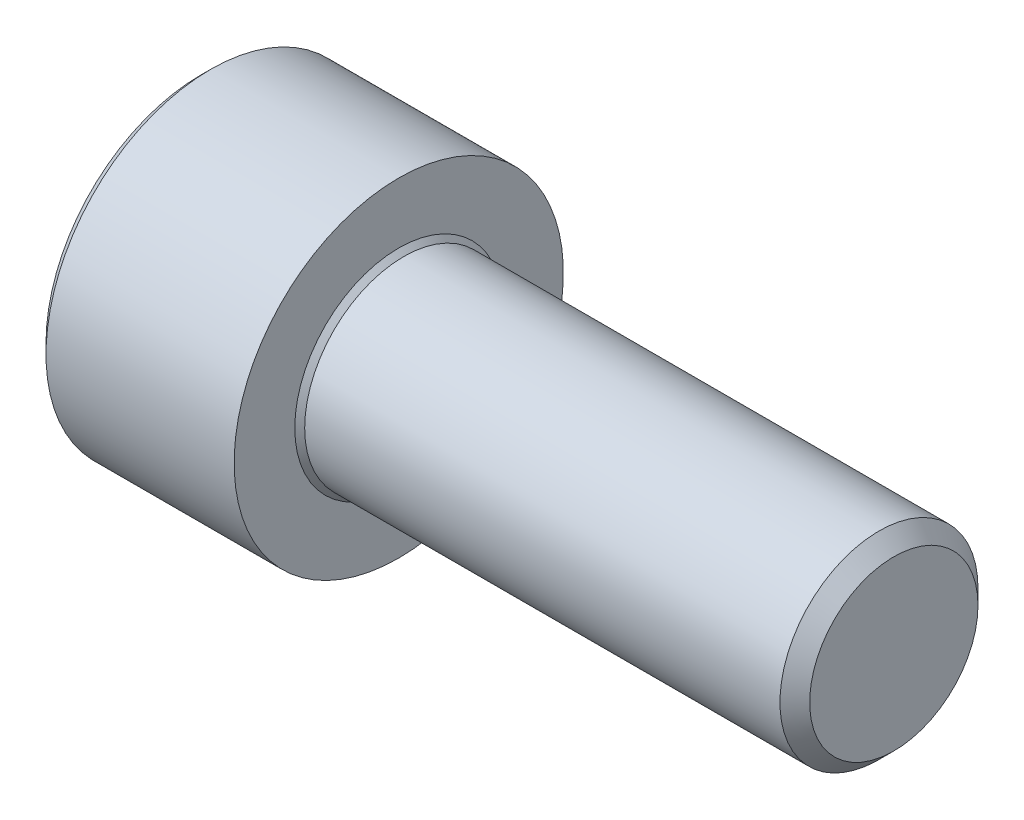
ISO-10303-21;
HEADER;
FILE_DESCRIPTION(('STEP AP214'),'2;1');
FILE_NAME('part.step','',(''),(''),'','','');
FILE_SCHEMA(('AUTOMOTIVE_DESIGN { 1 0 10303 214 1 1 1 1 }'));
ENDSEC;
DATA;
#1=APPLICATION_CONTEXT('core data for automotive mechanical design processes');
#2=APPLICATION_PROTOCOL_DEFINITION('international standard','automotive_design',2000,#1);
#3=PRODUCT_CONTEXT('',#1,'mechanical');
#4=PRODUCT('Part','Part','',(#3));
#5=PRODUCT_RELATED_PRODUCT_CATEGORY('part','',(#4));
#6=PRODUCT_DEFINITION_FORMATION('','',#4);
#7=PRODUCT_DEFINITION_CONTEXT('part definition',#1,'design');
#8=PRODUCT_DEFINITION('design','',#6,#7);
#9=PRODUCT_DEFINITION_SHAPE('','',#8);
#10=(LENGTH_UNIT() NAMED_UNIT(*) SI_UNIT(.MILLI.,.METRE.));
#11=(NAMED_UNIT(*) PLANE_ANGLE_UNIT() SI_UNIT($,.RADIAN.));
#12=(NAMED_UNIT(*) SI_UNIT($,.STERADIAN.) SOLID_ANGLE_UNIT());
#13=UNCERTAINTY_MEASURE_WITH_UNIT(LENGTH_MEASURE(1.E-05),#10,'distance_accuracy_value','');
#14=(GEOMETRIC_REPRESENTATION_CONTEXT(3) GLOBAL_UNCERTAINTY_ASSIGNED_CONTEXT((#13)) GLOBAL_UNIT_ASSIGNED_CONTEXT((#10,
#11,#12)) REPRESENTATION_CONTEXT('',''));
#15=CARTESIAN_POINT('',(0.,0.,0.));
#16=DIRECTION('',(0.,0.,1.));
#17=DIRECTION('',(1.,0.,0.));
#18=AXIS2_PLACEMENT_3D('',#15,#16,#17);
#19=CARTESIAN_POINT('',(-20.,0.,0.));
#20=DIRECTION('',(1.,0.,0.));
#21=DIRECTION('',(0.,0.,-1.));
#22=AXIS2_PLACEMENT_3D('',#19,#20,#21);
#23=CYLINDRICAL_SURFACE('',#22,4.);
#24=CARTESIAN_POINT('',(-19.8,0.,0.));
#25=DIRECTION('',(-1.,0.,0.));
#26=DIRECTION('',(0.,0.,1.));
#27=AXIS2_PLACEMENT_3D('',#24,#25,#26);
#28=CIRCLE('',#27,4.);
#29=CARTESIAN_POINT('',(-19.8,0.,4.));
#30=VERTEX_POINT('',#29);
#31=EDGE_CURVE('E54',#30,#30,#28,.F.);
#32=ORIENTED_EDGE('',*,*,#31,.T.);
#33=EDGE_LOOP('',(#32));
#34=FACE_BOUND('',#33,.T.);
#35=CARTESIAN_POINT('',(-0.6,0.,0.));
#36=DIRECTION('',(1.,0.,0.));
#37=DIRECTION('',(0.,0.,-1.));
#38=AXIS2_PLACEMENT_3D('',#35,#36,#37);
#39=CIRCLE('',#38,4.);
#40=CARTESIAN_POINT('',(-0.6,0.,-4.));
#41=VERTEX_POINT('',#40);
#42=EDGE_CURVE('E107',#41,#41,#39,.F.);
#43=ORIENTED_EDGE('',*,*,#42,.T.);
#44=EDGE_LOOP('',(#43));
#45=FACE_BOUND('',#44,.T.);
#46=ADVANCED_FACE('F44',(#34,#45),#23,.T.);
#47=CARTESIAN_POINT('',(0.,0.,0.));
#48=DIRECTION('',(1.,0.,0.));
#49=DIRECTION('',(0.,0.,-1.));
#50=AXIS2_PLACEMENT_3D('',#47,#48,#49);
#51=PLANE('',#50);
#52=CARTESIAN_POINT('',(0.,0.,0.));
#53=DIRECTION('',(1.,0.,0.));
#54=DIRECTION('',(0.,0.,-1.));
#55=AXIS2_PLACEMENT_3D('',#52,#53,#54);
#56=CIRCLE('',#55,3.4);
#57=CARTESIAN_POINT('',(0.,0.,-3.4));
#58=VERTEX_POINT('',#57);
#59=EDGE_CURVE('E139',#58,#58,#56,.T.);
#60=ORIENTED_EDGE('',*,*,#59,.T.);
#61=EDGE_LOOP('',(#60));
#62=FACE_BOUND('',#61,.T.);
#63=ADVANCED_FACE('F218',(#62),#51,.T.);
#64=CARTESIAN_POINT('',(0.,0.,0.));
#65=DIRECTION('',(-1.,0.,0.));
#66=DIRECTION('',(0.,0.,1.));
#67=AXIS2_PLACEMENT_3D('',#64,#65,#66);
#68=CONICAL_SURFACE('',#67,3.4,0.785398163397448);
#69=ORIENTED_EDGE('',*,*,#42,.F.);
#70=EDGE_LOOP('',(#69));
#71=FACE_BOUND('',#70,.T.);
#72=ORIENTED_EDGE('',*,*,#59,.F.);
#73=EDGE_LOOP('',(#72));
#74=FACE_BOUND('',#73,.T.);
#75=ADVANCED_FACE('F226',(#71,#74),#68,.T.);
#76=CARTESIAN_POINT('',(-28.,0.,0.));
#77=DIRECTION('',(1.,0.,0.));
#78=DIRECTION('',(0.,1.,0.));
#79=AXIS2_PLACEMENT_3D('',#76,#77,#78);
#80=PLANE('',#79);
#81=CARTESIAN_POINT('',(-28.,0.,0.));
#82=DIRECTION('',(1.,0.,0.));
#83=DIRECTION('',(0.,1.,0.));
#84=AXIS2_PLACEMENT_3D('',#81,#82,#83);
#85=CIRCLE('',#84,6.24999999999999);
#86=CARTESIAN_POINT('',(-28.,6.24999999999999,0.));
#87=VERTEX_POINT('',#86);
#88=EDGE_CURVE('E106',#87,#87,#85,.F.);
#89=ORIENTED_EDGE('',*,*,#88,.T.);
#90=EDGE_LOOP('',(#89));
#91=FACE_BOUND('',#90,.T.);
#92=CARTESIAN_POINT('',(-28.,0.,0.));
#93=DIRECTION('',(-1.,0.,0.));
#94=DIRECTION('',(0.,-1.,0.));
#95=AXIS2_PLACEMENT_3D('',#92,#93,#94);
#96=CIRCLE('',#95,3.62957166897565);
#97=CARTESIAN_POINT('',(-28.,-3.62957166897556,0.));
#98=VERTEX_POINT('',#97);
#99=EDGE_CURVE('E280',#98,#98,#96,.T.);
#100=ORIENTED_EDGE('',*,*,#99,.F.);
#101=EDGE_LOOP('',(#100));
#102=FACE_BOUND('',#101,.T.);
#103=ADVANCED_FACE('F234',(#91,#102),#80,.F.);
#104=CARTESIAN_POINT('',(-20.,0.,0.));
#105=DIRECTION('',(-1.,0.,0.));
#106=DIRECTION('',(0.,-1.,0.));
#107=AXIS2_PLACEMENT_3D('',#104,#105,#106);
#108=CYLINDRICAL_SURFACE('',#107,6.65);
#109=CARTESIAN_POINT('',(-27.6,0.,0.));
#110=DIRECTION('',(1.,0.,0.));
#111=DIRECTION('',(0.,1.,0.));
#112=AXIS2_PLACEMENT_3D('',#109,#110,#111);
#113=CIRCLE('',#112,6.65);
#114=CARTESIAN_POINT('',(-27.6,6.65,0.));
#115=VERTEX_POINT('',#114);
#116=EDGE_CURVE('E250',#115,#115,#113,.T.);
#117=ORIENTED_EDGE('',*,*,#116,.T.);
#118=EDGE_LOOP('',(#117));
#119=FACE_BOUND('',#118,.T.);
#120=CARTESIAN_POINT('',(-20.,0.,0.));
#121=DIRECTION('',(-1.,0.,0.));
#122=DIRECTION('',(0.,-1.,0.));
#123=AXIS2_PLACEMENT_3D('',#120,#121,#122);
#124=CIRCLE('',#123,6.65);
#125=CARTESIAN_POINT('',(-20.,-6.65,0.));
#126=VERTEX_POINT('',#125);
#127=EDGE_CURVE('E135',#126,#126,#124,.T.);
#128=ORIENTED_EDGE('',*,*,#127,.T.);
#129=EDGE_LOOP('',(#128));
#130=FACE_BOUND('',#129,.T.);
#131=ADVANCED_FACE('F264',(#119,#130),#108,.T.);
#132=CARTESIAN_POINT('',(-20.,6.65,0.));
#133=DIRECTION('',(-1.,0.,0.));
#134=DIRECTION('',(0.,-1.,0.));
#135=AXIS2_PLACEMENT_3D('',#132,#133,#134);
#136=PLANE('',#135);
#137=CARTESIAN_POINT('',(-20.,0.,0.));
#138=DIRECTION('',(-1.,0.,0.));
#139=DIRECTION('',(0.,-1.,0.));
#140=AXIS2_PLACEMENT_3D('',#137,#138,#139);
#141=CIRCLE('',#140,4.20000000000001);
#142=CARTESIAN_POINT('',(-20.,-4.20000000000002,0.));
#143=VERTEX_POINT('',#142);
#144=EDGE_CURVE('E11',#143,#143,#141,.T.);
#145=ORIENTED_EDGE('',*,*,#144,.T.);
#146=EDGE_LOOP('',(#145));
#147=FACE_BOUND('',#146,.T.);
#148=ORIENTED_EDGE('',*,*,#127,.F.);
#149=EDGE_LOOP('',(#148));
#150=FACE_BOUND('',#149,.T.);
#151=ADVANCED_FACE('F160',(#147,#150),#136,.F.);
#152=CARTESIAN_POINT('',(-28.,0.,0.));
#153=DIRECTION('',(-1.,0.,0.));
#154=DIRECTION('',(0.,-1.,0.));
#155=AXIS2_PLACEMENT_3D('',#152,#153,#154);
#156=CONICAL_SURFACE('',#155,3.62957166897565,0.78539816339745);
#157=ORIENTED_EDGE('',*,*,#99,.T.);
#158=EDGE_LOOP('',(#157));
#159=FACE_BOUND('',#158,.T.);
#160=CARTESIAN_POINT('',(-29.0966778127873,-3.56755296581059,3.1));
#161=CARTESIAN_POINT('',(-29.0311161232526,-3.48067790410367,3.1));
#162=CARTESIAN_POINT('',(-28.9661887699061,-3.39331620923981,3.1));
#163=CARTESIAN_POINT('',(-28.8378866761685,-3.21742767879113,3.1));
#164=CARTESIAN_POINT('',(-28.7745123299149,-3.12890055601865,3.1));
#165=CARTESIAN_POINT('',(-28.649149618772,-2.94984172912648,3.1));
#166=CARTESIAN_POINT('',(-28.5871757981815,-2.85929980759073,3.1));
#167=CARTESIAN_POINT('',(-28.4655433979381,-2.67667876769776,3.1));
#168=CARTESIAN_POINT('',(-28.4058846546568,-2.58459975864126,3.1));
#169=CARTESIAN_POINT('',(-28.2860634322284,-2.39333880852478,3.1));
#170=CARTESIAN_POINT('',(-28.226067549348,-2.29405196489696,3.1));
#171=CARTESIAN_POINT('',(-28.1100435205225,-2.09318971074535,3.1));
#172=CARTESIAN_POINT('',(-28.0540148512133,-1.99161460443372,3.1));
#173=CARTESIAN_POINT('',(-27.9471071965864,-1.78614313434786,3.1));
#174=CARTESIAN_POINT('',(-27.8962137659896,-1.68225434584986,3.1));
#175=CARTESIAN_POINT('',(-27.8007250984289,-1.47164476657799,3.1));
#176=CARTESIAN_POINT('',(-27.7561270112553,-1.36492528356403,3.1));
#177=CARTESIAN_POINT('',(-27.6780791107741,-1.15717561749278,3.1));
#178=CARTESIAN_POINT('',(-27.6440219111259,-1.05637601020153,3.1));
#179=CARTESIAN_POINT('',(-27.5839944895265,-0.852351702213475,3.1));
#180=CARTESIAN_POINT('',(-27.5580248252572,-0.749126834808678,3.1));
#181=CARTESIAN_POINT('',(-27.515960123557,-0.542584296261905,3.1));
#182=CARTESIAN_POINT('',(-27.4996960226579,-0.43930162736373,3.1));
#183=CARTESIAN_POINT('',(-27.4773578078193,-0.231634381452468,3.1));
#184=CARTESIAN_POINT('',(-27.4712819463665,-0.127249996500061,3.1));
#185=CARTESIAN_POINT('',(-27.4697706096531,0.0778226661237034,3.1));
#186=CARTESIAN_POINT('',(-27.4739588320412,0.178508299884043,3.1));
#187=CARTESIAN_POINT('',(-27.4919145762785,0.37901613246529,3.1));
#188=CARTESIAN_POINT('',(-27.5056830293795,0.478838246392155,3.1));
#189=CARTESIAN_POINT('',(-27.5422826007459,0.678584216339021,3.1));
#190=CARTESIAN_POINT('',(-27.5652678729591,0.778479371630526,3.1));
#191=CARTESIAN_POINT('',(-27.6190758371559,0.976093323750643,3.1));
#192=CARTESIAN_POINT('',(-27.649897870866,1.07381230262467,3.1));
#193=CARTESIAN_POINT('',(-27.7213006389723,1.2759762352524,3.1));
#194=CARTESIAN_POINT('',(-27.7625259239919,1.38019122842026,3.1));
#195=CARTESIAN_POINT('',(-27.8512993743554,1.58590011875272,3.1));
#196=CARTESIAN_POINT('',(-27.8988496597034,1.68739308978804,3.1));
#197=CARTESIAN_POINT('',(-27.9991499186658,1.88817606878426,3.1));
#198=CARTESIAN_POINT('',(-28.0519165970203,1.98745766429582,3.1));
#199=CARTESIAN_POINT('',(-28.1614790597013,2.1837338954766,3.1));
#200=CARTESIAN_POINT('',(-28.2182741177385,2.28072893921518,3.1));
#201=CARTESIAN_POINT('',(-28.3321945002047,2.46796072538623,3.1));
#202=CARTESIAN_POINT('',(-28.3891627105091,2.55829357029772,3.1));
#203=CARTESIAN_POINT('',(-28.5054943071269,2.73740848321003,3.1));
#204=CARTESIAN_POINT('',(-28.5648578748845,2.82619043300049,3.1));
#205=CARTESIAN_POINT('',(-28.6850615762685,3.00168651279023,3.1));
#206=CARTESIAN_POINT('',(-28.7458857953012,3.08841158246393,3.1));
#207=CARTESIAN_POINT('',(-28.8691424141669,3.26067659463282,3.1));
#208=CARTESIAN_POINT('',(-28.9315743671725,3.3462168564641,3.1));
#209=CARTESIAN_POINT('',(-28.994663620867,3.43126099500272,3.1));
#210=B_SPLINE_CURVE_WITH_KNOTS('',3,(#160,#161,#162,#163,#164,#165,#166,#167,#168,#169,#170,
#171,#172,#173,#174,#175,#176,#177,#178,#179,#180,#181,#182,#183,#184,#185,#186,#187,#188,#189,
#190,#191,#192,#193,#194,#195,#196,#197,#198,#199,#200,#201,#202,#203,#204,#205,#206,#207,#208,
#209),.UNSPECIFIED.,.F.,.F.,(4,2,2,2,2,2,2,2,2,2,2,2,2,2,2,2,2,2,2,2,2,2,2,2,4),(0.,
0.32651910346099,0.653120233460047,0.982252042504858,1.31136054618519,1.65930530346324,
2.00720407320819,2.35409520581046,2.70082877661264,3.01974116336226,3.33867553608027,
3.65187856640407,3.96502786983362,4.26686933605265,4.56874014704069,4.87588574323434,
5.1830055482768,5.51896181246359,5.85503096705022,6.19221352446939,6.52933544394894,
6.84967923351235,7.17004733430326,7.48781263156194,7.80549054763625),.UNSPECIFIED.);
#211=CARTESIAN_POINT('',(-27.95,-1.78978583448772,3.1));
#212=VERTEX_POINT('',#211);
#213=CARTESIAN_POINT('',(-27.95,1.78978583448796,3.1));
#214=VERTEX_POINT('',#213);
#215=EDGE_CURVE('E115',#212,#214,#210,.T.);
#216=ORIENTED_EDGE('',*,*,#215,.F.);
#217=CARTESIAN_POINT('',(-27.9501154756409,-3.5796871390294,-0.000200000000001046));
#218=CARTESIAN_POINT('',(-27.8886458413869,-3.51816436899457,0.106360563522694));
#219=CARTESIAN_POINT('',(-27.8307864793311,-3.45561286049913,0.214702954326885));
#220=CARTESIAN_POINT('',(-27.7248474874361,-3.32806350738969,0.435624914384972));
#221=CARTESIAN_POINT('',(-27.6768267995683,-3.26305353333647,0.548225492443879));
#222=CARTESIAN_POINT('',(-27.5945664858646,-3.13196404643605,0.775279144093547));
#223=CARTESIAN_POINT('',(-27.5601201085622,-3.06591791626565,0.889674397191981));
#224=CARTESIAN_POINT('',(-27.5070484160698,-2.9323716663704,1.12098328717085));
#225=CARTESIAN_POINT('',(-27.4883834861051,-2.86487562605888,1.23788985830013));
#226=CARTESIAN_POINT('',(-27.4715427496926,-2.74854898770011,1.4393735062112));
#227=CARTESIAN_POINT('',(-27.469049833711,-2.69986861521443,1.52369038468778));
#228=CARTESIAN_POINT('',(-27.473250485208,-2.6025870529261,1.69218699321084));
#229=CARTESIAN_POINT('',(-27.4799472731655,-2.5539858968612,1.77636666482182));
#230=CARTESIAN_POINT('',(-27.5021449572485,-2.4572440259476,1.94392850046346));
#231=CARTESIAN_POINT('',(-27.5176557012322,-2.40910388747707,2.02730966617782));
#232=CARTESIAN_POINT('',(-27.5566346963079,-2.31365039892472,2.19263995811019));
#233=CARTESIAN_POINT('',(-27.5801023373244,-2.26633698574813,2.27458919361153));
#234=CARTESIAN_POINT('',(-27.6283861417413,-2.18234172750146,2.42007324848963));
#235=CARTESIAN_POINT('',(-27.6519331228865,-2.145473967724,2.48393008158544));
#236=CARTESIAN_POINT('',(-27.7028221038117,-2.0724003374582,2.61049732189931));
#237=CARTESIAN_POINT('',(-27.7301642193392,-2.03619448719553,2.67320769408549));
#238=CARTESIAN_POINT('',(-27.7880304636165,-1.96455874040374,2.797284447167));
#239=CARTESIAN_POINT('',(-27.818544586688,-1.92912680637229,2.85865435711991));
#240=CARTESIAN_POINT('',(-27.8823540931801,-1.85891914401922,2.98025759539607));
#241=CARTESIAN_POINT('',(-27.9156477697171,-1.82414302882245,3.04049159380674));
#242=CARTESIAN_POINT('',(-27.9501154756409,-1.78967036443389,3.1002));
#243=B_SPLINE_CURVE_WITH_KNOTS('',3,(#217,#218,#219,#220,#221,#222,#223,#224,#225,#226,#227,
#228,#229,#230,#231,#232,#233,#234,#235,#236,#237,#238,#239,#240,#241,#242),.UNSPECIFIED.,.F.,
.F.,(4,2,2,2,2,2,2,2,2,2,2,2,4),(0.,0.412921851590123,0.828249440119199,1.2369810236876,
1.64468353236747,1.93644845298111,2.22831564704261,2.52050958815468,2.81268113107646,
3.04478441098685,3.27689477135683,3.50829399413468,3.73955214873887),.UNSPECIFIED.);
#244=CARTESIAN_POINT('',(-27.95,-3.57957166897556,0.));
#245=VERTEX_POINT('',#244);
#246=EDGE_CURVE('E182',#245,#212,#243,.T.);
#247=ORIENTED_EDGE('',*,*,#246,.F.);
#248=CARTESIAN_POINT('',(-27.9501154756409,-1.78967036443388,-3.1002));
#249=CARTESIAN_POINT('',(-27.8886458413869,-1.85119313446871,-2.9936394364773));
#250=CARTESIAN_POINT('',(-27.8307864793311,-1.91374464296416,-2.88529704567311));
#251=CARTESIAN_POINT('',(-27.7248474874361,-2.0412939960736,-2.66437508561502));
#252=CARTESIAN_POINT('',(-27.6768267995683,-2.10630397012682,-2.55177450755611));
#253=CARTESIAN_POINT('',(-27.5945664858646,-2.23739345702724,-2.32472085590644));
#254=CARTESIAN_POINT('',(-27.5601201085622,-2.30343958719764,-2.210325602808));
#255=CARTESIAN_POINT('',(-27.5070484160698,-2.4369858370929,-1.97901671282913));
#256=CARTESIAN_POINT('',(-27.4883834861051,-2.50448187740442,-1.86211014169985));
#257=CARTESIAN_POINT('',(-27.4715427496926,-2.62080851576319,-1.66062649378878));
#258=CARTESIAN_POINT('',(-27.469049833711,-2.66948888824887,-1.57630961531219));
#259=CARTESIAN_POINT('',(-27.473250485208,-2.7667704505372,-1.40781300678913));
#260=CARTESIAN_POINT('',(-27.4799472731655,-2.8153716066021,-1.32363333517815));
#261=CARTESIAN_POINT('',(-27.5021449572485,-2.9121134775157,-1.15607149953652));
#262=CARTESIAN_POINT('',(-27.5176557012322,-2.96025361598624,-1.07269033382215));
#263=CARTESIAN_POINT('',(-27.5566346963079,-3.05570710453858,-0.907360041889789));
#264=CARTESIAN_POINT('',(-27.5801023373244,-3.10302051771517,-0.82541080638844));
#265=CARTESIAN_POINT('',(-27.6283861417413,-3.18701577596184,-0.679926751510348));
#266=CARTESIAN_POINT('',(-27.6519331228865,-3.2238835357393,-0.616069918414541));
#267=CARTESIAN_POINT('',(-27.7028221038117,-3.2969571660051,-0.489502678100674));
#268=CARTESIAN_POINT('',(-27.7301642193392,-3.33316301626777,-0.426792305914496));
#269=CARTESIAN_POINT('',(-27.7880304636165,-3.40479876305955,-0.302715552832986));
#270=CARTESIAN_POINT('',(-27.818544586688,-3.440230697091,-0.241345642880082));
#271=CARTESIAN_POINT('',(-27.8823540931801,-3.51043835944407,-0.119742404603931));
#272=CARTESIAN_POINT('',(-27.9156477697171,-3.54521447464084,-0.0595084061932565));
#273=CARTESIAN_POINT('',(-27.9501154756409,-3.5796871390294,0.000199999999997691));
#274=B_SPLINE_CURVE_WITH_KNOTS('',3,(#248,#249,#250,#251,#252,#253,#254,#255,#256,#257,#258,
#259,#260,#261,#262,#263,#264,#265,#266,#267,#268,#269,#270,#271,#272,#273),.UNSPECIFIED.,.F.,
.F.,(4,2,2,2,2,2,2,2,2,2,2,2,4),(0.,0.41292185159013,0.828249440119214,1.23698102368763,
1.6446835323675,1.93644845298114,2.22831564704264,2.52050958815472,2.81268113107649,
3.04478441098687,3.27689477135685,3.50829399413469,3.73955214873887),.UNSPECIFIED.);
#275=CARTESIAN_POINT('',(-27.95,-1.78978583448772,-3.1));
#276=VERTEX_POINT('',#275);
#277=EDGE_CURVE('E175',#276,#245,#274,.T.);
#278=ORIENTED_EDGE('',*,*,#277,.F.);
#279=CARTESIAN_POINT('',(-29.0966778123796,-3.5675529652705,-3.1));
#280=CARTESIAN_POINT('',(-29.0311161228606,-3.48067790357873,-3.1));
#281=CARTESIAN_POINT('',(-28.9661887695298,-3.39331620873006,-3.1));
#282=CARTESIAN_POINT('',(-28.8378866758235,-3.21742767831192,-3.1));
#283=CARTESIAN_POINT('',(-28.7745123295854,-3.1289005555548,-3.1));
#284=CARTESIAN_POINT('',(-28.6491496184738,-2.94984172869384,-3.1));
#285=CARTESIAN_POINT('',(-28.5871757978991,-2.85929980717396,-3.1));
#286=CARTESIAN_POINT('',(-28.4655433976867,-2.67667876731301,-3.1));
#287=CARTESIAN_POINT('',(-28.4058846544209,-2.58459975827268,-3.1));
#288=CARTESIAN_POINT('',(-28.2860634320246,-2.39333880819104,-3.1));
#289=CARTESIAN_POINT('',(-28.2260675491609,-2.29405196458196,-3.1));
#290=CARTESIAN_POINT('',(-28.1100435203678,-2.09318971046849,-3.1));
#291=CARTESIAN_POINT('',(-28.0540148510745,-1.99161460417626,-3.1));
#292=CARTESIAN_POINT('',(-27.9471071964779,-1.7861431341299,-3.1));
#293=CARTESIAN_POINT('',(-27.8962137658957,-1.682254345652,-3.1));
#294=CARTESIAN_POINT('',(-27.8007250983622,-1.47164476642141,-3.1));
#295=CARTESIAN_POINT('',(-27.7561270112013,-1.36492528342862,-3.1));
#296=CARTESIAN_POINT('',(-27.6780791107295,-1.15717561736652,-3.1));
#297=CARTESIAN_POINT('',(-27.6440219110805,-1.05637601006232,-3.1));
#298=CARTESIAN_POINT('',(-27.5839944894822,-0.852351702047949,-3.1));
#299=CARTESIAN_POINT('',(-27.5580248252147,-0.749126834629782,-3.1));
#300=CARTESIAN_POINT('',(-27.5159601235212,-0.54258429605671,-3.1));
#301=CARTESIAN_POINT('',(-27.4996960226269,-0.439301627145611,-3.1));
#302=CARTESIAN_POINT('',(-27.4773578078007,-0.231634381208937,-3.1));
#303=CARTESIAN_POINT('',(-27.4712819463555,-0.12724999624404,-3.1));
#304=CARTESIAN_POINT('',(-27.4697706096598,0.0778226664027906,-3.1));
#305=CARTESIAN_POINT('',(-27.4739588320576,0.17850830017374,-3.1));
#306=CARTESIAN_POINT('',(-27.4919145763159,0.379016132775146,-3.1));
#307=CARTESIAN_POINT('',(-27.505683029428,0.47883824671156,-3.1));
#308=CARTESIAN_POINT('',(-27.5422826008181,0.678584216677278,-3.1));
#309=CARTESIAN_POINT('',(-27.5652678730436,0.778479371978057,-3.1));
#310=CARTESIAN_POINT('',(-27.6190758372655,0.976093324115827,-3.1));
#311=CARTESIAN_POINT('',(-27.6498978709882,1.07381230299824,-3.1));
#312=CARTESIAN_POINT('',(-27.7213006391307,1.27597623567069,-3.1));
#313=CARTESIAN_POINT('',(-27.7625259241758,1.3801912288741,-3.1));
#314=CARTESIAN_POINT('',(-27.8512993745931,1.58590011927585,-3.1));
#315=CARTESIAN_POINT('',(-27.8988496599691,1.6873930903449,-3.1));
#316=CARTESIAN_POINT('',(-27.9991499189895,1.88817606940736,-3.1));
#317=CARTESIAN_POINT('',(-28.0519165973738,1.98745766495143,-3.1));
#318=CARTESIAN_POINT('',(-28.1614790601154,2.18373389619618,-3.1));
#319=CARTESIAN_POINT('',(-28.2182741181833,2.28072893996623,-3.1));
#320=CARTESIAN_POINT('',(-28.332194500708,2.46796072619444,-3.1));
#321=CARTESIAN_POINT('',(-28.3891627110399,2.55829357113175,-3.1));
#322=CARTESIAN_POINT('',(-28.5054943077128,2.73740848409534,-3.1));
#323=CARTESIAN_POINT('',(-28.5648578754981,2.82619043391126,-3.1));
#324=CARTESIAN_POINT('',(-28.685061576937,3.0016865137513,-3.1));
#325=CARTESIAN_POINT('',(-28.745885795997,3.08841158344984,-3.1));
#326=CARTESIAN_POINT('',(-28.8691424149173,3.26067659566825,-3.1));
#327=CARTESIAN_POINT('',(-28.9315743679501,3.34621685752421,-3.1));
#328=CARTESIAN_POINT('',(-28.9946636216719,3.43126099608748,-3.1));
#329=B_SPLINE_CURVE_WITH_KNOTS('',3,(#279,#280,#281,#282,#283,#284,#285,#286,#287,#288,#289,
#290,#291,#292,#293,#294,#295,#296,#297,#298,#299,#300,#301,#302,#303,#304,#305,#306,#307,#308,
#309,#310,#311,#312,#313,#314,#315,#316,#317,#318,#319,#320,#321,#322,#323,#324,#325,#326,#327,
#328),.UNSPECIFIED.,.F.,.F.,(4,2,2,2,2,2,2,2,2,2,2,2,2,2,2,2,2,2,2,2,2,2,2,2,4),(0.,
0.326519103396346,0.65312023333074,0.982252042309678,1.31136054592414,1.6593053031283,
2.00720407279938,2.35409520532836,2.70082877605738,3.01974116284443,3.3386755355998,
3.65187856595945,3.96502786942485,4.26686933567676,4.56874014669772,4.87588574292679,
5.18300554800467,5.51896181231868,5.85503096703267,6.19221352457993,6.52933544418752,
6.84967923386048,7.17004733476095,7.4878126321277,7.80549054831008),.UNSPECIFIED.);
#330=CARTESIAN_POINT('',(-27.95,1.78978583448796,-3.1));
#331=VERTEX_POINT('',#330);
#332=EDGE_CURVE('E61',#331,#276,#329,.F.);
#333=ORIENTED_EDGE('',*,*,#332,.F.);
#334=CARTESIAN_POINT('',(-27.950115475641,3.57968713902964,0.000199999999999951));
#335=CARTESIAN_POINT('',(-27.8886458413869,3.51816436899481,-0.106360563522698));
#336=CARTESIAN_POINT('',(-27.8307864793311,3.45561286049936,-0.214702954326891));
#337=CARTESIAN_POINT('',(-27.7248474874362,3.32806350738992,-0.435624914384981));
#338=CARTESIAN_POINT('',(-27.6768267995683,3.2630535333367,-0.548225492443889));
#339=CARTESIAN_POINT('',(-27.5945664858646,3.13196404643628,-0.775279144093562));
#340=CARTESIAN_POINT('',(-27.5601201085622,3.06591791626588,-0.889674397191998));
#341=CARTESIAN_POINT('',(-27.5070484160698,2.93237166637062,-1.12098328717087));
#342=CARTESIAN_POINT('',(-27.4883834861051,2.8648756260591,-1.23788985830015));
#343=CARTESIAN_POINT('',(-27.4715427496926,2.74854898770033,-1.43937350621122));
#344=CARTESIAN_POINT('',(-27.469049833711,2.69986861521464,-1.52369038468781));
#345=CARTESIAN_POINT('',(-27.4732504852081,2.60258705292631,-1.69218699321088));
#346=CARTESIAN_POINT('',(-27.4799472731655,2.55398589686142,-1.77636666482186));
#347=CARTESIAN_POINT('',(-27.5021449572485,2.45724402594781,-1.9439285004635));
#348=CARTESIAN_POINT('',(-27.5176557012323,2.40910388747728,-2.02730966617786));
#349=CARTESIAN_POINT('',(-27.556634696308,2.31365039892493,-2.19263995811023));
#350=CARTESIAN_POINT('',(-27.5801023373244,2.26633698574834,-2.27458919361158));
#351=CARTESIAN_POINT('',(-27.6283861417413,2.18234172750167,-2.42007324848967));
#352=CARTESIAN_POINT('',(-27.6519331228866,2.14547396772421,-2.48393008158547));
#353=CARTESIAN_POINT('',(-27.7028221038118,2.07240033745842,-2.61049732189934));
#354=CARTESIAN_POINT('',(-27.7301642193393,2.03619448719575,-2.67320769408552));
#355=CARTESIAN_POINT('',(-27.7880304636165,1.96455874040396,-2.79728444716702));
#356=CARTESIAN_POINT('',(-27.818544586688,1.92912680637251,-2.85865435711993));
#357=CARTESIAN_POINT('',(-27.8823540931801,1.85891914401945,-2.98025759539607));
#358=CARTESIAN_POINT('',(-27.9156477697171,1.82414302882268,-3.04049159380675));
#359=CARTESIAN_POINT('',(-27.950115475641,1.78967036443412,-3.1002));
#360=B_SPLINE_CURVE_WITH_KNOTS('',3,(#334,#335,#336,#337,#338,#339,#340,#341,#342,#343,#344,
#345,#346,#347,#348,#349,#350,#351,#352,#353,#354,#355,#356,#357,#358,#359),.UNSPECIFIED.,.F.,
.F.,(4,2,2,2,2,2,2,2,2,2,2,2,4),(0.,0.41292185159013,0.828249440119214,1.23698102368762,
1.6446835323675,1.93644845298115,2.22831564704265,2.52050958815473,2.81268113107651,
3.04478441098689,3.27689477135686,3.50829399413469,3.73955214873887),.UNSPECIFIED.);
#361=CARTESIAN_POINT('',(-27.9500000000001,3.5795716689758,0.));
#362=VERTEX_POINT('',#361);
#363=EDGE_CURVE('E98',#362,#331,#360,.T.);
#364=ORIENTED_EDGE('',*,*,#363,.F.);
#365=CARTESIAN_POINT('',(-27.950115475641,1.78967036443412,3.1002));
#366=CARTESIAN_POINT('',(-27.8886458413869,1.85119313446895,2.9936394364773));
#367=CARTESIAN_POINT('',(-27.8307864793311,1.9137446429644,2.88529704567311));
#368=CARTESIAN_POINT('',(-27.7248474874362,2.04129399607383,2.66437508561503));
#369=CARTESIAN_POINT('',(-27.6768267995683,2.10630397012705,2.55177450755612));
#370=CARTESIAN_POINT('',(-27.5945664858646,2.23739345702747,2.32472085590645));
#371=CARTESIAN_POINT('',(-27.5601201085622,2.30343958719787,2.21032560280802));
#372=CARTESIAN_POINT('',(-27.5070484160698,2.43698583709312,1.97901671282915));
#373=CARTESIAN_POINT('',(-27.4883834861051,2.50448187740464,1.86211014169987));
#374=CARTESIAN_POINT('',(-27.4715427496926,2.62080851576341,1.6606264937888));
#375=CARTESIAN_POINT('',(-27.469049833711,2.6694888882491,1.57630961531221));
#376=CARTESIAN_POINT('',(-27.4732504852081,2.76677045053743,1.40781300678915));
#377=CARTESIAN_POINT('',(-27.4799472731655,2.81537160660232,1.32363333517817));
#378=CARTESIAN_POINT('',(-27.5021449572485,2.91211347751593,1.15607149953653));
#379=CARTESIAN_POINT('',(-27.5176557012323,2.96025361598646,1.07269033382216));
#380=CARTESIAN_POINT('',(-27.556634696308,3.05570710453881,0.907360041889799));
#381=CARTESIAN_POINT('',(-27.5801023373244,3.1030205177154,0.825410806388448));
#382=CARTESIAN_POINT('',(-27.6283861417413,3.18701577596207,0.679926751510354));
#383=CARTESIAN_POINT('',(-27.6519331228866,3.22388353573953,0.616069918414546));
#384=CARTESIAN_POINT('',(-27.7028221038118,3.29695716600533,0.489502678100677));
#385=CARTESIAN_POINT('',(-27.7301642193393,3.333163016268,0.426792305914499));
#386=CARTESIAN_POINT('',(-27.7880304636165,3.40479876305979,0.302715552832987));
#387=CARTESIAN_POINT('',(-27.818544586688,3.44023069709124,0.241345642880083));
#388=CARTESIAN_POINT('',(-27.8823540931801,3.51043835944431,0.11974240460393));
#389=CARTESIAN_POINT('',(-27.9156477697172,3.54521447464108,0.0595084061932548));
#390=CARTESIAN_POINT('',(-27.950115475641,3.57968713902964,-0.000200000000000137));
#391=B_SPLINE_CURVE_WITH_KNOTS('',3,(#365,#366,#367,#368,#369,#370,#371,#372,#373,#374,#375,
#376,#377,#378,#379,#380,#381,#382,#383,#384,#385,#386,#387,#388,#389,#390),.UNSPECIFIED.,.F.,
.F.,(4,2,2,2,2,2,2,2,2,2,2,2,4),(0.,0.412921851590121,0.828249440119197,1.2369810236876,
1.64468353236747,1.93644845298111,2.22831564704262,2.52050958815469,2.81268113107647,
3.04478441098686,3.27689477135684,3.50829399413468,3.73955214873887),.UNSPECIFIED.);
#392=EDGE_CURVE('E101',#214,#362,#391,.T.);
#393=ORIENTED_EDGE('',*,*,#392,.F.);
#394=EDGE_LOOP('',(#216,#247,#278,#333,#364,#393));
#395=FACE_BOUND('',#394,.T.);
#396=ADVANCED_FACE('F100',(#159,#395),#156,.F.);
#397=CARTESIAN_POINT('',(-24.,0.,0.));
#398=DIRECTION('',(-1.,0.,0.));
#399=DIRECTION('',(0.,-1.,0.));
#400=AXIS2_PLACEMENT_3D('',#397,#398,#399);
#401=PLANE('',#400);
#402=DIRECTION('',(0.,0.5,-0.866025403784439));
#403=VECTOR('',#402,1.);
#404=CARTESIAN_POINT('',(-24.,1.78978583448794,3.1));
#405=LINE('',#404,#403);
#406=CARTESIAN_POINT('',(-24.,1.78978583448794,3.1));
#407=VERTEX_POINT('',#406);
#408=CARTESIAN_POINT('',(-24.,3.57957166897578,0.));
#409=VERTEX_POINT('',#408);
#410=EDGE_CURVE('E114',#407,#409,#405,.T.);
#411=ORIENTED_EDGE('',*,*,#410,.T.);
#412=DIRECTION('',(0.,-0.5,-0.866025403784439));
#413=VECTOR('',#412,1.);
#414=CARTESIAN_POINT('',(-24.,3.57957166897578,0.));
#415=LINE('',#414,#413);
#416=CARTESIAN_POINT('',(-24.,1.78978583448794,-3.1));
#417=VERTEX_POINT('',#416);
#418=EDGE_CURVE('E119',#409,#417,#415,.T.);
#419=ORIENTED_EDGE('',*,*,#418,.T.);
#420=DIRECTION('',(0.,-1.,0.));
#421=VECTOR('',#420,1.);
#422=CARTESIAN_POINT('',(-24.,1.78978583448794,-3.1));
#423=LINE('',#422,#421);
#424=CARTESIAN_POINT('',(-24.,-1.78978583448774,-3.1));
#425=VERTEX_POINT('',#424);
#426=EDGE_CURVE('E312',#417,#425,#423,.T.);
#427=ORIENTED_EDGE('',*,*,#426,.T.);
#428=DIRECTION('',(0.,-0.5,0.866025403784439));
#429=VECTOR('',#428,1.);
#430=CARTESIAN_POINT('',(-24.,-1.78978583448774,-3.1));
#431=LINE('',#430,#429);
#432=CARTESIAN_POINT('',(-24.,-3.57957166897558,0.));
#433=VERTEX_POINT('',#432);
#434=EDGE_CURVE('E309',#425,#433,#431,.T.);
#435=ORIENTED_EDGE('',*,*,#434,.T.);
#436=DIRECTION('',(0.,0.5,0.866025403784439));
#437=VECTOR('',#436,1.);
#438=CARTESIAN_POINT('',(-24.,-3.57957166897558,0.));
#439=LINE('',#438,#437);
#440=CARTESIAN_POINT('',(-24.,-1.78978583448774,3.1));
#441=VERTEX_POINT('',#440);
#442=EDGE_CURVE('E131',#433,#441,#439,.T.);
#443=ORIENTED_EDGE('',*,*,#442,.T.);
#444=DIRECTION('',(0.,1.,0.));
#445=VECTOR('',#444,1.);
#446=CARTESIAN_POINT('',(-24.,-1.78978583448774,3.1));
#447=LINE('',#446,#445);
#448=EDGE_CURVE('E123',#441,#407,#447,.T.);
#449=ORIENTED_EDGE('',*,*,#448,.T.);
#450=EDGE_LOOP('',(#411,#419,#427,#435,#443,#449));
#451=FACE_BOUND('',#450,.T.);
#452=ADVANCED_FACE('F159',(#451),#401,.T.);
#453=CARTESIAN_POINT('',(-24.,3.57957166897578,0.));
#454=DIRECTION('',(0.,0.866025403784439,-0.5));
#455=DIRECTION('',(0.,0.5,0.866025403784439));
#456=AXIS2_PLACEMENT_3D('',#453,#454,#455);
#457=PLANE('',#456);
#458=DIRECTION('',(-1.,0.,0.));
#459=VECTOR('',#458,1.);
#460=CARTESIAN_POINT('',(-24.,3.57957166897578,0.));
#461=LINE('',#460,#459);
#462=EDGE_CURVE('E111',#409,#362,#461,.T.);
#463=ORIENTED_EDGE('',*,*,#462,.T.);
#464=ORIENTED_EDGE('',*,*,#363,.T.);
#465=DIRECTION('',(-1.,0.,0.));
#466=VECTOR('',#465,1.);
#467=CARTESIAN_POINT('',(-24.,1.78978583448794,-3.1));
#468=LINE('',#467,#466);
#469=EDGE_CURVE('E122',#417,#331,#468,.T.);
#470=ORIENTED_EDGE('',*,*,#469,.F.);
#471=ORIENTED_EDGE('',*,*,#418,.F.);
#472=EDGE_LOOP('',(#463,#464,#470,#471));
#473=FACE_BOUND('',#472,.T.);
#474=ADVANCED_FACE('F117',(#473),#457,.F.);
#475=CARTESIAN_POINT('',(-24.,1.78978583448794,-3.1));
#476=DIRECTION('',(0.,0.,-1.));
#477=DIRECTION('',(0.,1.,0.));
#478=AXIS2_PLACEMENT_3D('',#475,#476,#477);
#479=PLANE('',#478);
#480=ORIENTED_EDGE('',*,*,#469,.T.);
#481=ORIENTED_EDGE('',*,*,#332,.T.);
#482=DIRECTION('',(-1.,0.,0.));
#483=VECTOR('',#482,1.);
#484=CARTESIAN_POINT('',(-24.,-1.78978583448774,-3.1));
#485=LINE('',#484,#483);
#486=EDGE_CURVE('E128',#425,#276,#485,.T.);
#487=ORIENTED_EDGE('',*,*,#486,.F.);
#488=ORIENTED_EDGE('',*,*,#426,.F.);
#489=EDGE_LOOP('',(#480,#481,#487,#488));
#490=FACE_BOUND('',#489,.T.);
#491=ADVANCED_FACE('F209',(#490),#479,.F.);
#492=CARTESIAN_POINT('',(-24.,-1.78978583448774,-3.1));
#493=DIRECTION('',(0.,-0.866025403784439,-0.5));
#494=DIRECTION('',(0.,0.5,-0.866025403784439));
#495=AXIS2_PLACEMENT_3D('',#492,#493,#494);
#496=PLANE('',#495);
#497=ORIENTED_EDGE('',*,*,#486,.T.);
#498=ORIENTED_EDGE('',*,*,#277,.T.);
#499=DIRECTION('',(-1.,0.,0.));
#500=VECTOR('',#499,1.);
#501=CARTESIAN_POINT('',(-24.,-3.57957166897558,0.));
#502=LINE('',#501,#500);
#503=EDGE_CURVE('E297',#433,#245,#502,.T.);
#504=ORIENTED_EDGE('',*,*,#503,.F.);
#505=ORIENTED_EDGE('',*,*,#434,.F.);
#506=EDGE_LOOP('',(#497,#498,#504,#505));
#507=FACE_BOUND('',#506,.T.);
#508=ADVANCED_FACE('F205',(#507),#496,.F.);
#509=CARTESIAN_POINT('',(-24.,-3.57957166897558,0.));
#510=DIRECTION('',(0.,-0.866025403784439,0.5));
#511=DIRECTION('',(0.,-0.5,-0.866025403784439));
#512=AXIS2_PLACEMENT_3D('',#509,#510,#511);
#513=PLANE('',#512);
#514=ORIENTED_EDGE('',*,*,#503,.T.);
#515=ORIENTED_EDGE('',*,*,#246,.T.);
#516=DIRECTION('',(-1.,0.,0.));
#517=VECTOR('',#516,1.);
#518=CARTESIAN_POINT('',(-24.,-1.78978583448774,3.1));
#519=LINE('',#518,#517);
#520=EDGE_CURVE('E295',#441,#212,#519,.T.);
#521=ORIENTED_EDGE('',*,*,#520,.F.);
#522=ORIENTED_EDGE('',*,*,#442,.F.);
#523=EDGE_LOOP('',(#514,#515,#521,#522));
#524=FACE_BOUND('',#523,.T.);
#525=ADVANCED_FACE('F202',(#524),#513,.F.);
#526=CARTESIAN_POINT('',(-24.,-1.78978583448774,3.1));
#527=DIRECTION('',(0.,0.,1.));
#528=DIRECTION('',(0.,-1.,0.));
#529=AXIS2_PLACEMENT_3D('',#526,#527,#528);
#530=PLANE('',#529);
#531=ORIENTED_EDGE('',*,*,#520,.T.);
#532=ORIENTED_EDGE('',*,*,#215,.T.);
#533=DIRECTION('',(-1.,0.,0.));
#534=VECTOR('',#533,1.);
#535=CARTESIAN_POINT('',(-24.,1.78978583448794,3.1));
#536=LINE('',#535,#534);
#537=EDGE_CURVE('E69',#407,#214,#536,.T.);
#538=ORIENTED_EDGE('',*,*,#537,.F.);
#539=ORIENTED_EDGE('',*,*,#448,.F.);
#540=EDGE_LOOP('',(#531,#532,#538,#539));
#541=FACE_BOUND('',#540,.T.);
#542=ADVANCED_FACE('F199',(#541),#530,.F.);
#543=CARTESIAN_POINT('',(-24.,1.78978583448794,3.1));
#544=DIRECTION('',(0.,0.866025403784439,0.5));
#545=DIRECTION('',(0.,-0.5,0.866025403784439));
#546=AXIS2_PLACEMENT_3D('',#543,#544,#545);
#547=PLANE('',#546);
#548=ORIENTED_EDGE('',*,*,#537,.T.);
#549=ORIENTED_EDGE('',*,*,#392,.T.);
#550=ORIENTED_EDGE('',*,*,#462,.F.);
#551=ORIENTED_EDGE('',*,*,#410,.F.);
#552=EDGE_LOOP('',(#548,#549,#550,#551));
#553=FACE_BOUND('',#552,.T.);
#554=ADVANCED_FACE('F110',(#553),#547,.F.);
#555=CARTESIAN_POINT('',(-28.,0.,0.));
#556=DIRECTION('',(1.,0.,0.));
#557=DIRECTION('',(0.,1.,0.));
#558=AXIS2_PLACEMENT_3D('',#555,#556,#557);
#559=CONICAL_SURFACE('',#558,6.24999999999999,0.785398163397443);
#560=ORIENTED_EDGE('',*,*,#116,.F.);
#561=EDGE_LOOP('',(#560));
#562=FACE_BOUND('',#561,.T.);
#563=ORIENTED_EDGE('',*,*,#88,.F.);
#564=EDGE_LOOP('',(#563));
#565=FACE_BOUND('',#564,.T.);
#566=ADVANCED_FACE('F237',(#562,#565),#559,.T.);
#567=CARTESIAN_POINT('',(-19.8,0.,0.));
#568=DIRECTION('',(-1.,0.,0.));
#569=DIRECTION('',(0.,0.,1.));
#570=AXIS2_PLACEMENT_3D('',#567,#568,#569);
#571=CONICAL_SURFACE('',#570,4.,0.78539816339744);
#572=ORIENTED_EDGE('',*,*,#144,.F.);
#573=EDGE_LOOP('',(#572));
#574=FACE_BOUND('',#573,.T.);
#575=ORIENTED_EDGE('',*,*,#31,.F.);
#576=EDGE_LOOP('',(#575));
#577=FACE_BOUND('',#576,.T.);
#578=ADVANCED_FACE('F47',(#574,#577),#571,.T.);
#579=CLOSED_SHELL('',(#46,#63,#75,#103,#131,#151,#396,#452,#474,#491,#508,#525,#542,#554,#566,#578));
#580=MANIFOLD_SOLID_BREP('B2',#579);
#581=ADVANCED_BREP_SHAPE_REPRESENTATION('',(#18,#580),#14);
#582=SHAPE_DEFINITION_REPRESENTATION(#9,#581);
ENDSEC;
END-ISO-10303-21;
